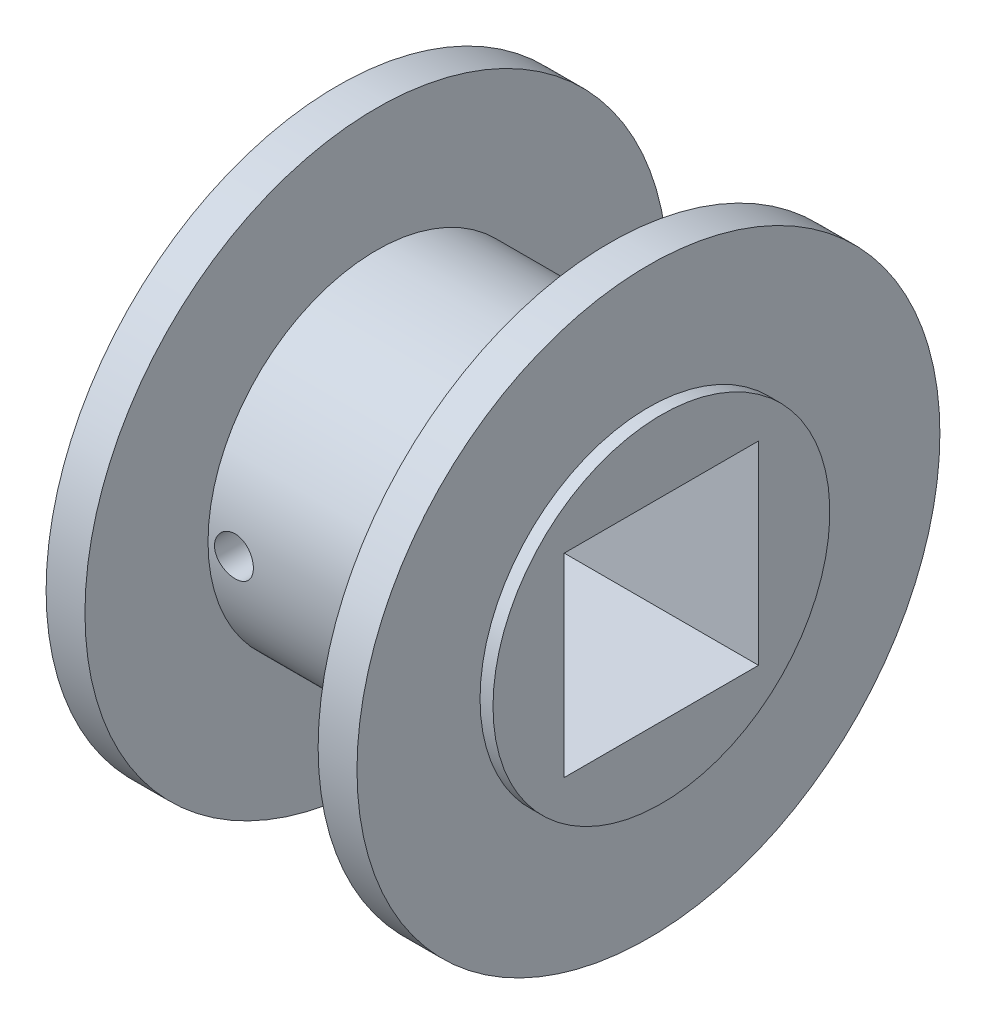
ISO-10303-21;
HEADER;
FILE_DESCRIPTION(('STEP AP214'),'2;1');
FILE_NAME('part.step','',(''),(''),'','','');
FILE_SCHEMA(('AUTOMOTIVE_DESIGN { 1 0 10303 214 1 1 1 1 }'));
ENDSEC;
DATA;
#1=APPLICATION_CONTEXT('core data for automotive mechanical design processes');
#2=APPLICATION_PROTOCOL_DEFINITION('international standard','automotive_design',2000,#1);
#3=PRODUCT_CONTEXT('',#1,'mechanical');
#4=PRODUCT('Part','Part','',(#3));
#5=PRODUCT_RELATED_PRODUCT_CATEGORY('part','',(#4));
#6=PRODUCT_DEFINITION_FORMATION('','',#4);
#7=PRODUCT_DEFINITION_CONTEXT('part definition',#1,'design');
#8=PRODUCT_DEFINITION('design','',#6,#7);
#9=PRODUCT_DEFINITION_SHAPE('','',#8);
#10=(LENGTH_UNIT() NAMED_UNIT(*) SI_UNIT(.MILLI.,.METRE.));
#11=(NAMED_UNIT(*) PLANE_ANGLE_UNIT() SI_UNIT($,.RADIAN.));
#12=(NAMED_UNIT(*) SI_UNIT($,.STERADIAN.) SOLID_ANGLE_UNIT());
#13=UNCERTAINTY_MEASURE_WITH_UNIT(LENGTH_MEASURE(1.E-05),#10,'distance_accuracy_value','');
#14=(GEOMETRIC_REPRESENTATION_CONTEXT(3) GLOBAL_UNCERTAINTY_ASSIGNED_CONTEXT((#13)) GLOBAL_UNIT_ASSIGNED_CONTEXT((#10,
#11,#12)) REPRESENTATION_CONTEXT('',''));
#15=CARTESIAN_POINT('',(0.,0.,0.));
#16=DIRECTION('',(0.,0.,1.));
#17=DIRECTION('',(1.,0.,0.));
#18=AXIS2_PLACEMENT_3D('',#15,#16,#17);
#19=CARTESIAN_POINT('',(0.,13.,0.));
#20=DIRECTION('',(1.,0.,0.));
#21=DIRECTION('',(0.,0.,-1.));
#22=AXIS2_PLACEMENT_3D('',#19,#20,#21);
#23=PLANE('',#22);
#24=CARTESIAN_POINT('',(0.,0.,0.));
#25=DIRECTION('',(-1.,0.,0.));
#26=DIRECTION('',(0.,0.,1.));
#27=AXIS2_PLACEMENT_3D('',#24,#25,#26);
#28=CIRCLE('',#27,13.);
#29=CARTESIAN_POINT('',(0.,0.,13.));
#30=VERTEX_POINT('',#29);
#31=EDGE_CURVE('E109',#30,#30,#28,.T.);
#32=ORIENTED_EDGE('',*,*,#31,.T.);
#33=EDGE_LOOP('',(#32));
#34=FACE_BOUND('',#33,.T.);
#35=DIRECTION('',(0.,-1.,0.));
#36=VECTOR('',#35,1.);
#37=CARTESIAN_POINT('',(0.,0.,7.5));
#38=LINE('',#37,#36);
#39=CARTESIAN_POINT('',(0.,7.5,7.5));
#40=VERTEX_POINT('',#39);
#41=CARTESIAN_POINT('',(0.,-7.5,7.5));
#42=VERTEX_POINT('',#41);
#43=EDGE_CURVE('E55',#40,#42,#38,.T.);
#44=ORIENTED_EDGE('',*,*,#43,.T.);
#45=DIRECTION('',(0.,0.,-1.));
#46=VECTOR('',#45,1.);
#47=CARTESIAN_POINT('',(0.,-7.5,0.));
#48=LINE('',#47,#46);
#49=CARTESIAN_POINT('',(0.,-7.5,-7.5));
#50=VERTEX_POINT('',#49);
#51=EDGE_CURVE('E78',#42,#50,#48,.T.);
#52=ORIENTED_EDGE('',*,*,#51,.T.);
#53=DIRECTION('',(0.,-1.,0.));
#54=VECTOR('',#53,1.);
#55=CARTESIAN_POINT('',(0.,0.,-7.5));
#56=LINE('',#55,#54);
#57=CARTESIAN_POINT('',(0.,7.5,-7.5));
#58=VERTEX_POINT('',#57);
#59=EDGE_CURVE('E90',#58,#50,#56,.T.);
#60=ORIENTED_EDGE('',*,*,#59,.F.);
#61=DIRECTION('',(0.,0.,-1.));
#62=VECTOR('',#61,1.);
#63=CARTESIAN_POINT('',(0.,7.5,0.));
#64=LINE('',#63,#62);
#65=EDGE_CURVE('E83',#40,#58,#64,.T.);
#66=ORIENTED_EDGE('',*,*,#65,.F.);
#67=EDGE_LOOP('',(#44,#52,#60,#66));
#68=FACE_BOUND('',#67,.T.);
#69=ADVANCED_FACE('F38',(#34,#68),#23,.F.);
#70=CARTESIAN_POINT('',(26.,13.,0.));
#71=DIRECTION('',(-1.,0.,0.));
#72=DIRECTION('',(0.,0.,1.));
#73=AXIS2_PLACEMENT_3D('',#70,#71,#72);
#74=PLANE('',#73);
#75=CARTESIAN_POINT('',(26.,0.,0.));
#76=DIRECTION('',(-1.,0.,0.));
#77=DIRECTION('',(0.,0.,1.));
#78=AXIS2_PLACEMENT_3D('',#75,#76,#77);
#79=CIRCLE('',#78,13.);
#80=CARTESIAN_POINT('',(26.,0.,13.));
#81=VERTEX_POINT('',#80);
#82=EDGE_CURVE('E145',#81,#81,#79,.T.);
#83=ORIENTED_EDGE('',*,*,#82,.F.);
#84=EDGE_LOOP('',(#83));
#85=FACE_BOUND('',#84,.T.);
#86=DIRECTION('',(0.,0.,1.));
#87=VECTOR('',#86,1.);
#88=CARTESIAN_POINT('',(26.,-7.5,0.));
#89=LINE('',#88,#87);
#90=CARTESIAN_POINT('',(26.,-7.5,-7.5));
#91=VERTEX_POINT('',#90);
#92=CARTESIAN_POINT('',(26.,-7.5,7.5));
#93=VERTEX_POINT('',#92);
#94=EDGE_CURVE('E47',#91,#93,#89,.T.);
#95=ORIENTED_EDGE('',*,*,#94,.T.);
#96=DIRECTION('',(0.,1.,0.));
#97=VECTOR('',#96,1.);
#98=CARTESIAN_POINT('',(26.,13.,7.5));
#99=LINE('',#98,#97);
#100=CARTESIAN_POINT('',(26.,7.5,7.5));
#101=VERTEX_POINT('',#100);
#102=EDGE_CURVE('E11',#93,#101,#99,.T.);
#103=ORIENTED_EDGE('',*,*,#102,.T.);
#104=DIRECTION('',(0.,0.,1.));
#105=VECTOR('',#104,1.);
#106=CARTESIAN_POINT('',(26.,7.5,0.));
#107=LINE('',#106,#105);
#108=CARTESIAN_POINT('',(26.,7.5,-7.5));
#109=VERTEX_POINT('',#108);
#110=EDGE_CURVE('E151',#109,#101,#107,.T.);
#111=ORIENTED_EDGE('',*,*,#110,.F.);
#112=DIRECTION('',(0.,1.,0.));
#113=VECTOR('',#112,1.);
#114=CARTESIAN_POINT('',(26.,13.,-7.5));
#115=LINE('',#114,#113);
#116=EDGE_CURVE('E98',#91,#109,#115,.T.);
#117=ORIENTED_EDGE('',*,*,#116,.F.);
#118=EDGE_LOOP('',(#95,#103,#111,#117));
#119=FACE_BOUND('',#118,.T.);
#120=ADVANCED_FACE('F215',(#85,#119),#74,.F.);
#121=CARTESIAN_POINT('',(0.,0.,0.));
#122=DIRECTION('',(-1.,0.,0.));
#123=DIRECTION('',(0.,0.,1.));
#124=AXIS2_PLACEMENT_3D('',#121,#122,#123);
#125=CYLINDRICAL_SURFACE('',#124,13.);
#126=CARTESIAN_POINT('',(25.,0.,0.));
#127=DIRECTION('',(-1.,0.,0.));
#128=DIRECTION('',(0.,0.,1.));
#129=AXIS2_PLACEMENT_3D('',#126,#127,#128);
#130=CIRCLE('',#129,13.);
#131=CARTESIAN_POINT('',(25.,0.,13.));
#132=VERTEX_POINT('',#131);
#133=EDGE_CURVE('E141',#132,#132,#130,.T.);
#134=ORIENTED_EDGE('',*,*,#133,.F.);
#135=EDGE_LOOP('',(#134));
#136=FACE_BOUND('',#135,.T.);
#137=ORIENTED_EDGE('',*,*,#82,.T.);
#138=EDGE_LOOP('',(#137));
#139=FACE_BOUND('',#138,.T.);
#140=ADVANCED_FACE('F221',(#136,#139),#125,.T.);
#141=CARTESIAN_POINT('',(25.,22.5,0.));
#142=DIRECTION('',(-1.,0.,0.));
#143=DIRECTION('',(0.,0.,1.));
#144=AXIS2_PLACEMENT_3D('',#141,#142,#143);
#145=PLANE('',#144);
#146=CARTESIAN_POINT('',(25.,0.,0.));
#147=DIRECTION('',(-1.,0.,0.));
#148=DIRECTION('',(0.,0.,1.));
#149=AXIS2_PLACEMENT_3D('',#146,#147,#148);
#150=CIRCLE('',#149,22.5);
#151=CARTESIAN_POINT('',(25.,0.,22.5));
#152=VERTEX_POINT('',#151);
#153=EDGE_CURVE('E137',#152,#152,#150,.T.);
#154=ORIENTED_EDGE('',*,*,#153,.F.);
#155=EDGE_LOOP('',(#154));
#156=FACE_BOUND('',#155,.T.);
#157=ORIENTED_EDGE('',*,*,#133,.T.);
#158=EDGE_LOOP('',(#157));
#159=FACE_BOUND('',#158,.T.);
#160=ADVANCED_FACE('F233',(#156,#159),#145,.F.);
#161=CARTESIAN_POINT('',(0.,0.,0.));
#162=DIRECTION('',(-1.,0.,0.));
#163=DIRECTION('',(0.,0.,1.));
#164=AXIS2_PLACEMENT_3D('',#161,#162,#163);
#165=CYLINDRICAL_SURFACE('',#164,22.5);
#166=CARTESIAN_POINT('',(22.,0.,0.));
#167=DIRECTION('',(-1.,0.,0.));
#168=DIRECTION('',(0.,0.,1.));
#169=AXIS2_PLACEMENT_3D('',#166,#167,#168);
#170=CIRCLE('',#169,22.5);
#171=CARTESIAN_POINT('',(22.,0.,22.5));
#172=VERTEX_POINT('',#171);
#173=EDGE_CURVE('E133',#172,#172,#170,.T.);
#174=ORIENTED_EDGE('',*,*,#173,.F.);
#175=EDGE_LOOP('',(#174));
#176=FACE_BOUND('',#175,.T.);
#177=ORIENTED_EDGE('',*,*,#153,.T.);
#178=EDGE_LOOP('',(#177));
#179=FACE_BOUND('',#178,.T.);
#180=ADVANCED_FACE('F240',(#176,#179),#165,.T.);
#181=CARTESIAN_POINT('',(22.,22.5,0.));
#182=DIRECTION('',(1.,0.,0.));
#183=DIRECTION('',(0.,0.,-1.));
#184=AXIS2_PLACEMENT_3D('',#181,#182,#183);
#185=PLANE('',#184);
#186=CARTESIAN_POINT('',(22.,0.,0.));
#187=DIRECTION('',(-1.,0.,0.));
#188=DIRECTION('',(0.,0.,1.));
#189=AXIS2_PLACEMENT_3D('',#186,#187,#188);
#190=CIRCLE('',#189,13.);
#191=CARTESIAN_POINT('',(22.,0.,13.));
#192=VERTEX_POINT('',#191);
#193=EDGE_CURVE('E129',#192,#192,#190,.T.);
#194=ORIENTED_EDGE('',*,*,#193,.F.);
#195=EDGE_LOOP('',(#194));
#196=FACE_BOUND('',#195,.T.);
#197=ORIENTED_EDGE('',*,*,#173,.T.);
#198=EDGE_LOOP('',(#197));
#199=FACE_BOUND('',#198,.T.);
#200=ADVANCED_FACE('F210',(#196,#199),#185,.F.);
#201=CARTESIAN_POINT('',(0.,0.,0.));
#202=DIRECTION('',(-1.,0.,0.));
#203=DIRECTION('',(0.,0.,1.));
#204=AXIS2_PLACEMENT_3D('',#201,#202,#203);
#205=CYLINDRICAL_SURFACE('',#204,13.);
#206=CARTESIAN_POINT('',(7.5,0.,13.));
#207=CARTESIAN_POINT('',(7.4999964031671,-0.0839563147427422,12.9999989044515));
#208=CARTESIAN_POINT('',(7.4929275849652,-0.167966345196187,12.999178081572));
#209=CARTESIAN_POINT('',(7.46483826496663,-0.333652235419372,12.995982599614));
#210=CARTESIAN_POINT('',(7.44380286531638,-0.415325505475653,12.9936062813601));
#211=CARTESIAN_POINT('',(7.38840533385725,-0.57391497224922,12.9875677351869));
#212=CARTESIAN_POINT('',(7.35405179569065,-0.650834199520698,12.9839063366207));
#213=CARTESIAN_POINT('',(7.27301111812132,-0.79779979378714,12.9757057473599));
#214=CARTESIAN_POINT('',(7.22632623210123,-0.867847413269117,12.9711667170809));
#215=CARTESIAN_POINT('',(7.12171196440118,-0.999427807179225,12.9616943551208));
#216=CARTESIAN_POINT('',(7.06373605262275,-1.06092347729183,12.9567594432832));
#217=CARTESIAN_POINT('',(6.93828516324756,-1.17333502414497,12.9470643855765));
#218=CARTESIAN_POINT('',(6.87080972079665,-1.2242503828419,12.9423042482743));
#219=CARTESIAN_POINT('',(6.72803733610484,-1.3141916873334,12.9334819604022));
#220=CARTESIAN_POINT('',(6.65271863992229,-1.3531833171573,12.9294218388056));
#221=CARTESIAN_POINT('',(6.49654783804119,-1.41795120910938,12.9224797052987));
#222=CARTESIAN_POINT('',(6.41569591201296,-1.44372790011126,12.9195976551562));
#223=CARTESIAN_POINT('',(6.25113647537629,-1.48122247723766,12.9153528047108));
#224=CARTESIAN_POINT('',(6.1674433262594,-1.49300261981048,12.9139832786549));
#225=CARTESIAN_POINT('',(5.99925756045587,-1.50236226854616,12.9128978570991));
#226=CARTESIAN_POINT('',(5.91476497143115,-1.49994226427626,12.9131819045903));
#227=CARTESIAN_POINT('',(5.7478106867289,-1.48102150197295,12.9153653842397));
#228=CARTESIAN_POINT('',(5.66534113040741,-1.46458907258954,12.9172569773873));
#229=CARTESIAN_POINT('',(5.50433810598175,-1.41821640637187,12.9224301836669));
#230=CARTESIAN_POINT('',(5.42580470681433,-1.38827593305336,12.9257118211342));
#231=CARTESIAN_POINT('',(5.27468953076391,-1.31566282618376,12.9333043079058));
#232=CARTESIAN_POINT('',(5.20212227049773,-1.27296024500285,12.9376175732259));
#233=CARTESIAN_POINT('',(5.06515827049276,-1.17605655290097,12.9467853893456));
#234=CARTESIAN_POINT('',(5.00076184949449,-1.12185499363063,12.9516399612475));
#235=CARTESIAN_POINT('',(4.88157071619169,-1.0031120359915,12.9613782949516));
#236=CARTESIAN_POINT('',(4.82683470870206,-0.938511694342138,12.9662620604919));
#237=CARTESIAN_POINT('',(4.72897438783242,-0.801008592236028,12.9754816969276));
#238=CARTESIAN_POINT('',(4.68585009493269,-0.728105817136097,12.9798175668567));
#239=CARTESIAN_POINT('',(4.61243828715519,-0.576023905679869,12.9874550212078));
#240=CARTESIAN_POINT('',(4.58215416157141,-0.496843118716624,12.9907563324875));
#241=CARTESIAN_POINT('',(4.53532747265761,-0.334473831095741,12.9959501177405));
#242=CARTESIAN_POINT('',(4.51878436163703,-0.251285490311373,12.9978426478647));
#243=CARTESIAN_POINT('',(4.49998472362037,-0.0837704200050156,12.999998373659));
#244=CARTESIAN_POINT('',(4.49764727106811,0.000547113543202191,13.0002707984127));
#245=CARTESIAN_POINT('',(4.50711215461105,0.168372695685008,12.9991804669134));
#246=CARTESIAN_POINT('',(4.51891423501223,0.251880758889225,12.9978177402298));
#247=CARTESIAN_POINT('',(4.556255972808,0.415480266956158,12.993616027243));
#248=CARTESIAN_POINT('',(4.58175732870877,0.495580568872892,12.9907811576039));
#249=CARTESIAN_POINT('',(4.64573409622904,0.650367161714357,12.9839527929212));
#250=CARTESIAN_POINT('',(4.68420988816444,0.725053293857115,12.9799592639147));
#251=CARTESIAN_POINT('',(4.77324114512289,0.867254744569764,12.9712363785455));
#252=CARTESIAN_POINT('',(4.82384929591281,0.934736878832464,12.9665038451426));
#253=CARTESIAN_POINT('',(4.93563374481516,1.06027784673838,12.9568430886348));
#254=CARTESIAN_POINT('',(4.99681039844914,1.11833636324618,12.9519148589511));
#255=CARTESIAN_POINT('',(5.12835038533594,1.22366664140003,12.9423899602444));
#256=CARTESIAN_POINT('',(5.19875664350889,1.27088497439797,12.9377950067668));
#257=CARTESIAN_POINT('',(5.34654757584497,1.35282617315314,12.9294843210235));
#258=CARTESIAN_POINT('',(5.42393212787651,1.38754925754463,12.9257685733744));
#259=CARTESIAN_POINT('',(5.58330615373548,1.44342658284102,12.9196483466479));
#260=CARTESIAN_POINT('',(5.66528470793035,1.46461162925533,12.91724089246));
#261=CARTESIAN_POINT('',(5.83166493951436,1.49291104062265,12.9140010380224));
#262=CARTESIAN_POINT('',(5.91606652196453,1.5000259561095,12.9131685761467));
#263=CARTESIAN_POINT('',(6.08436565375942,1.49997405326829,12.9131745631781));
#264=CARTESIAN_POINT('',(6.168263241811,1.49289116482699,12.9140031925958));
#265=CARTESIAN_POINT('',(6.33366750199322,1.46482172327171,12.9172169582806));
#266=CARTESIAN_POINT('',(6.41517417276498,1.44383516225564,12.9196020954322));
#267=CARTESIAN_POINT('',(6.57347609168935,1.38857911797313,12.9256572251488));
#268=CARTESIAN_POINT('',(6.65027254258119,1.35431304208042,12.9293268880955));
#269=CARTESIAN_POINT('',(6.79703840038789,1.27347900341466,12.9375381901497));
#270=CARTESIAN_POINT('',(6.86700777212214,1.22691097725304,12.9420798337501));
#271=CARTESIAN_POINT('',(6.99856295332932,1.12248173071088,12.9515555600008));
#272=CARTESIAN_POINT('',(7.06009892117499,1.06455790771248,12.9564917239034));
#273=CARTESIAN_POINT('',(7.17261111489077,0.93919005418629,12.9661816355574));
#274=CARTESIAN_POINT('',(7.22358483240877,0.871743768617549,12.9709353397599));
#275=CARTESIAN_POINT('',(7.31366356407028,0.728996893197093,12.9797415177439));
#276=CARTESIAN_POINT('',(7.35272930568544,0.653671391511423,12.9837916526637));
#277=CARTESIAN_POINT('',(7.41760310503946,0.497527270565884,12.9907101076694));
#278=CARTESIAN_POINT('',(7.44342579213558,0.4167148249134,12.993579731148));
#279=CARTESIAN_POINT('',(7.47479285483811,0.279556305332051,12.9971099824635));
#280=CARTESIAN_POINT('',(7.48423222713368,0.224080319679962,12.9981885527758));
#281=CARTESIAN_POINT('',(7.49683698528069,0.112410914672188,12.9996339262189));
#282=CARTESIAN_POINT('',(7.50000240845436,0.0562174995863225,13.0000007335839));
#283=CARTESIAN_POINT('',(7.5,0.,13.));
#284=B_SPLINE_CURVE_WITH_KNOTS('',3,(#206,#207,#208,#209,#210,#211,#212,#213,#214,#215,#216,
#217,#218,#219,#220,#221,#222,#223,#224,#225,#226,#227,#228,#229,#230,#231,#232,#233,#234,#235,
#236,#237,#238,#239,#240,#241,#242,#243,#244,#245,#246,#247,#248,#249,#250,#251,#252,#253,#254,
#255,#256,#257,#258,#259,#260,#261,#262,#263,#264,#265,#266,#267,#268,#269,#270,#271,#272,#273,
#274,#275,#276,#277,#278,#279,#280,#281,#282,#283),.UNSPECIFIED.,.T.,.F.,(4,2,2,2,2,2,2,2,2,2,2,
2,2,2,2,2,2,2,2,2,2,2,2,2,2,2,2,2,2,2,2,2,2,2,2,2,2,2,4),(0.,0.251663624421979,
0.503596125244171,0.755366334321089,1.00709056767771,1.25987498270023,1.51267177188699,
1.76618939688668,2.0196987937799,2.27207631201581,2.52444512928255,2.77559031440111,
3.02673989646913,3.27848351780672,3.53023695652505,3.78347119880911,4.0367058877347,
4.29000737900445,4.54329877367693,4.79514587715501,5.04698842639316,5.29813049175019,
5.54927991940194,5.80154039645154,6.05380936112788,6.30729621090899,6.56077862511548,
6.81368217226278,7.0665758236448,7.31797891068329,7.56938214060554,7.82072090595902,
8.07206096641734,8.32482769676521,8.57765438622356,8.83130609524226,9.08467699305617,
9.25319301127889,9.42170802703663),.UNSPECIFIED.);
#285=CARTESIAN_POINT('',(7.5,0.,13.));
#286=VERTEX_POINT('',#285);
#287=EDGE_CURVE('E162',#286,#286,#284,.T.);
#288=ORIENTED_EDGE('',*,*,#287,.T.);
#289=EDGE_LOOP('',(#288));
#290=FACE_BOUND('',#289,.T.);
#291=CARTESIAN_POINT('',(4.,0.,0.));
#292=DIRECTION('',(-1.,0.,0.));
#293=DIRECTION('',(0.,0.,1.));
#294=AXIS2_PLACEMENT_3D('',#291,#292,#293);
#295=CIRCLE('',#294,13.);
#296=CARTESIAN_POINT('',(4.,0.,13.));
#297=VERTEX_POINT('',#296);
#298=EDGE_CURVE('E125',#297,#297,#295,.T.);
#299=ORIENTED_EDGE('',*,*,#298,.F.);
#300=EDGE_LOOP('',(#299));
#301=FACE_BOUND('',#300,.T.);
#302=ORIENTED_EDGE('',*,*,#193,.T.);
#303=EDGE_LOOP('',(#302));
#304=FACE_BOUND('',#303,.T.);
#305=ADVANCED_FACE('F172',(#290,#301,#304),#205,.T.);
#306=CARTESIAN_POINT('',(4.,22.5,0.));
#307=DIRECTION('',(-1.,0.,0.));
#308=DIRECTION('',(0.,0.,1.));
#309=AXIS2_PLACEMENT_3D('',#306,#307,#308);
#310=PLANE('',#309);
#311=CARTESIAN_POINT('',(4.,0.,0.));
#312=DIRECTION('',(-1.,0.,0.));
#313=DIRECTION('',(0.,0.,1.));
#314=AXIS2_PLACEMENT_3D('',#311,#312,#313);
#315=CIRCLE('',#314,22.5);
#316=CARTESIAN_POINT('',(4.,0.,22.5));
#317=VERTEX_POINT('',#316);
#318=EDGE_CURVE('E121',#317,#317,#315,.T.);
#319=ORIENTED_EDGE('',*,*,#318,.F.);
#320=EDGE_LOOP('',(#319));
#321=FACE_BOUND('',#320,.T.);
#322=ORIENTED_EDGE('',*,*,#298,.T.);
#323=EDGE_LOOP('',(#322));
#324=FACE_BOUND('',#323,.T.);
#325=ADVANCED_FACE('F202',(#321,#324),#310,.F.);
#326=CARTESIAN_POINT('',(0.,0.,0.));
#327=DIRECTION('',(-1.,0.,0.));
#328=DIRECTION('',(0.,0.,1.));
#329=AXIS2_PLACEMENT_3D('',#326,#327,#328);
#330=CYLINDRICAL_SURFACE('',#329,22.5);
#331=CARTESIAN_POINT('',(1.,0.,0.));
#332=DIRECTION('',(-1.,0.,0.));
#333=DIRECTION('',(0.,0.,1.));
#334=AXIS2_PLACEMENT_3D('',#331,#332,#333);
#335=CIRCLE('',#334,22.5);
#336=CARTESIAN_POINT('',(1.,0.,22.5));
#337=VERTEX_POINT('',#336);
#338=EDGE_CURVE('E117',#337,#337,#335,.T.);
#339=ORIENTED_EDGE('',*,*,#338,.F.);
#340=EDGE_LOOP('',(#339));
#341=FACE_BOUND('',#340,.T.);
#342=ORIENTED_EDGE('',*,*,#318,.T.);
#343=EDGE_LOOP('',(#342));
#344=FACE_BOUND('',#343,.T.);
#345=ADVANCED_FACE('F199',(#341,#344),#330,.T.);
#346=CARTESIAN_POINT('',(1.,22.5,0.));
#347=DIRECTION('',(1.,0.,0.));
#348=DIRECTION('',(0.,0.,-1.));
#349=AXIS2_PLACEMENT_3D('',#346,#347,#348);
#350=PLANE('',#349);
#351=CARTESIAN_POINT('',(1.,0.,0.));
#352=DIRECTION('',(-1.,0.,0.));
#353=DIRECTION('',(0.,0.,1.));
#354=AXIS2_PLACEMENT_3D('',#351,#352,#353);
#355=CIRCLE('',#354,13.);
#356=CARTESIAN_POINT('',(1.,0.,13.));
#357=VERTEX_POINT('',#356);
#358=EDGE_CURVE('E113',#357,#357,#355,.T.);
#359=ORIENTED_EDGE('',*,*,#358,.F.);
#360=EDGE_LOOP('',(#359));
#361=FACE_BOUND('',#360,.T.);
#362=ORIENTED_EDGE('',*,*,#338,.T.);
#363=EDGE_LOOP('',(#362));
#364=FACE_BOUND('',#363,.T.);
#365=ADVANCED_FACE('F195',(#361,#364),#350,.F.);
#366=CARTESIAN_POINT('',(0.,0.,0.));
#367=DIRECTION('',(-1.,0.,0.));
#368=DIRECTION('',(0.,0.,1.));
#369=AXIS2_PLACEMENT_3D('',#366,#367,#368);
#370=CYLINDRICAL_SURFACE('',#369,13.);
#371=ORIENTED_EDGE('',*,*,#31,.F.);
#372=EDGE_LOOP('',(#371));
#373=FACE_BOUND('',#372,.T.);
#374=ORIENTED_EDGE('',*,*,#358,.T.);
#375=EDGE_LOOP('',(#374));
#376=FACE_BOUND('',#375,.T.);
#377=ADVANCED_FACE('F192',(#373,#376),#370,.T.);
#378=CARTESIAN_POINT('',(0.,-7.5,0.));
#379=DIRECTION('',(0.,-1.,0.));
#380=DIRECTION('',(0.,0.,-1.));
#381=AXIS2_PLACEMENT_3D('',#378,#379,#380);
#382=PLANE('',#381);
#383=ORIENTED_EDGE('',*,*,#51,.F.);
#384=DIRECTION('',(1.,0.,0.));
#385=VECTOR('',#384,1.);
#386=CARTESIAN_POINT('',(0.,-7.5,7.5));
#387=LINE('',#386,#385);
#388=EDGE_CURVE('E104',#42,#93,#387,.T.);
#389=ORIENTED_EDGE('',*,*,#388,.T.);
#390=ORIENTED_EDGE('',*,*,#94,.F.);
#391=DIRECTION('',(1.,0.,0.));
#392=VECTOR('',#391,1.);
#393=CARTESIAN_POINT('',(0.,-7.5,-7.5));
#394=LINE('',#393,#392);
#395=EDGE_CURVE('E100',#50,#91,#394,.T.);
#396=ORIENTED_EDGE('',*,*,#395,.F.);
#397=EDGE_LOOP('',(#383,#389,#390,#396));
#398=FACE_BOUND('',#397,.T.);
#399=ADVANCED_FACE('F184',(#398),#382,.F.);
#400=CARTESIAN_POINT('',(0.,0.,7.5));
#401=DIRECTION('',(0.,0.,1.));
#402=DIRECTION('',(0.,-1.,0.));
#403=AXIS2_PLACEMENT_3D('',#400,#401,#402);
#404=PLANE('',#403);
#405=CARTESIAN_POINT('',(6.,0.,7.5));
#406=DIRECTION('',(0.,0.,-1.));
#407=DIRECTION('',(0.,1.,0.));
#408=AXIS2_PLACEMENT_3D('',#405,#406,#407);
#409=CIRCLE('',#408,1.5);
#410=CARTESIAN_POINT('',(6.,1.5,7.5));
#411=VERTEX_POINT('',#410);
#412=EDGE_CURVE('E171',#411,#411,#409,.T.);
#413=ORIENTED_EDGE('',*,*,#412,.F.);
#414=EDGE_LOOP('',(#413));
#415=FACE_BOUND('',#414,.T.);
#416=ORIENTED_EDGE('',*,*,#43,.F.);
#417=DIRECTION('',(1.,0.,0.));
#418=VECTOR('',#417,1.);
#419=CARTESIAN_POINT('',(0.,7.5,7.5));
#420=LINE('',#419,#418);
#421=EDGE_CURVE('E88',#40,#101,#420,.T.);
#422=ORIENTED_EDGE('',*,*,#421,.T.);
#423=ORIENTED_EDGE('',*,*,#102,.F.);
#424=ORIENTED_EDGE('',*,*,#388,.F.);
#425=EDGE_LOOP('',(#416,#422,#423,#424));
#426=FACE_BOUND('',#425,.T.);
#427=ADVANCED_FACE('F181',(#415,#426),#404,.F.);
#428=CARTESIAN_POINT('',(0.,7.5,0.));
#429=DIRECTION('',(0.,-1.,0.));
#430=DIRECTION('',(0.,0.,-1.));
#431=AXIS2_PLACEMENT_3D('',#428,#429,#430);
#432=PLANE('',#431);
#433=ORIENTED_EDGE('',*,*,#65,.T.);
#434=DIRECTION('',(1.,0.,0.));
#435=VECTOR('',#434,1.);
#436=CARTESIAN_POINT('',(0.,7.5,-7.5));
#437=LINE('',#436,#435);
#438=EDGE_CURVE('E86',#58,#109,#437,.T.);
#439=ORIENTED_EDGE('',*,*,#438,.T.);
#440=ORIENTED_EDGE('',*,*,#110,.T.);
#441=ORIENTED_EDGE('',*,*,#421,.F.);
#442=EDGE_LOOP('',(#433,#439,#440,#441));
#443=FACE_BOUND('',#442,.T.);
#444=ADVANCED_FACE('F84',(#443),#432,.T.);
#445=CARTESIAN_POINT('',(0.,0.,-7.5));
#446=DIRECTION('',(0.,0.,1.));
#447=DIRECTION('',(0.,-1.,0.));
#448=AXIS2_PLACEMENT_3D('',#445,#446,#447);
#449=PLANE('',#448);
#450=ORIENTED_EDGE('',*,*,#438,.F.);
#451=ORIENTED_EDGE('',*,*,#59,.T.);
#452=ORIENTED_EDGE('',*,*,#395,.T.);
#453=ORIENTED_EDGE('',*,*,#116,.T.);
#454=EDGE_LOOP('',(#450,#451,#452,#453));
#455=FACE_BOUND('',#454,.T.);
#456=ADVANCED_FACE('F97',(#455),#449,.T.);
#457=CARTESIAN_POINT('',(6.,0.,22.5));
#458=DIRECTION('',(0.,0.,-1.));
#459=DIRECTION('',(0.,1.,0.));
#460=AXIS2_PLACEMENT_3D('',#457,#458,#459);
#461=CYLINDRICAL_SURFACE('',#460,1.5);
#462=ORIENTED_EDGE('',*,*,#412,.T.);
#463=EDGE_LOOP('',(#462));
#464=FACE_BOUND('',#463,.T.);
#465=ORIENTED_EDGE('',*,*,#287,.F.);
#466=EDGE_LOOP('',(#465));
#467=FACE_BOUND('',#466,.T.);
#468=ADVANCED_FACE('F176',(#464,#467),#461,.F.);
#469=CLOSED_SHELL('',(#69,#120,#140,#160,#180,#200,#305,#325,#345,#365,#377,#399,#427,#444,#456,#468));
#470=MANIFOLD_SOLID_BREP('B2',#469);
#471=ADVANCED_BREP_SHAPE_REPRESENTATION('',(#18,#470),#14);
#472=SHAPE_DEFINITION_REPRESENTATION(#9,#471);
ENDSEC;
END-ISO-10303-21;
